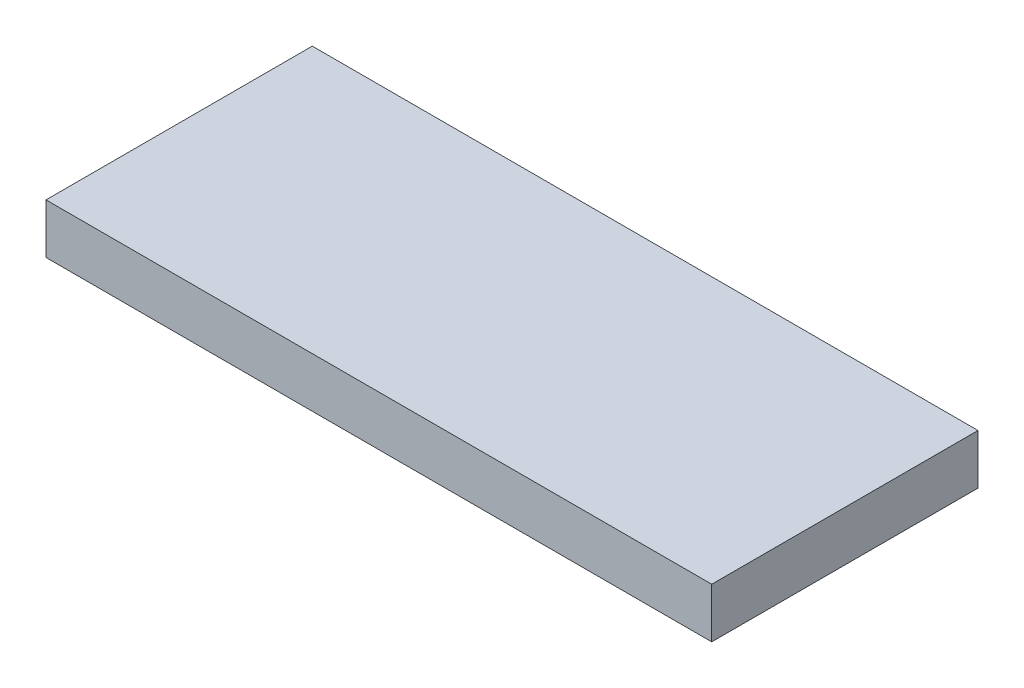
ISO-10303-21;
HEADER;
FILE_DESCRIPTION(('STEP AP214'),'2;1');
FILE_NAME('part.step','',(''),(''),'','','');
FILE_SCHEMA(('AUTOMOTIVE_DESIGN { 1 0 10303 214 1 1 1 1 }'));
ENDSEC;
DATA;
#1=APPLICATION_CONTEXT('core data for automotive mechanical design processes');
#2=APPLICATION_PROTOCOL_DEFINITION('international standard','automotive_design',2000,#1);
#3=PRODUCT_CONTEXT('',#1,'mechanical');
#4=PRODUCT('Part','Part','',(#3));
#5=PRODUCT_RELATED_PRODUCT_CATEGORY('part','',(#4));
#6=PRODUCT_DEFINITION_FORMATION('','',#4);
#7=PRODUCT_DEFINITION_CONTEXT('part definition',#1,'design');
#8=PRODUCT_DEFINITION('design','',#6,#7);
#9=PRODUCT_DEFINITION_SHAPE('','',#8);
#10=(LENGTH_UNIT() NAMED_UNIT(*) SI_UNIT(.MILLI.,.METRE.));
#11=(NAMED_UNIT(*) PLANE_ANGLE_UNIT() SI_UNIT($,.RADIAN.));
#12=(NAMED_UNIT(*) SI_UNIT($,.STERADIAN.) SOLID_ANGLE_UNIT());
#13=UNCERTAINTY_MEASURE_WITH_UNIT(LENGTH_MEASURE(1.E-05),#10,'distance_accuracy_value','');
#14=(GEOMETRIC_REPRESENTATION_CONTEXT(3) GLOBAL_UNCERTAINTY_ASSIGNED_CONTEXT((#13)) GLOBAL_UNIT_ASSIGNED_CONTEXT((#10,
#11,#12)) REPRESENTATION_CONTEXT('',''));
#15=CARTESIAN_POINT('',(0.,0.,0.));
#16=DIRECTION('',(0.,0.,1.));
#17=DIRECTION('',(1.,0.,0.));
#18=AXIS2_PLACEMENT_3D('',#15,#16,#17);
#19=CARTESIAN_POINT('',(-10.,1.5,4.));
#20=DIRECTION('',(1.,0.,0.));
#21=DIRECTION('',(0.,0.,-1.));
#22=AXIS2_PLACEMENT_3D('',#19,#20,#21);
#23=PLANE('',#22);
#24=DIRECTION('',(0.,0.,1.));
#25=VECTOR('',#24,1.);
#26=CARTESIAN_POINT('',(-10.,0.,4.));
#27=LINE('',#26,#25);
#28=CARTESIAN_POINT('',(-10.,0.,-4.));
#29=VERTEX_POINT('',#28);
#30=CARTESIAN_POINT('',(-10.,0.,4.));
#31=VERTEX_POINT('',#30);
#32=EDGE_CURVE('E102',#29,#31,#27,.T.);
#33=ORIENTED_EDGE('',*,*,#32,.T.);
#34=DIRECTION('',(0.,-1.,0.));
#35=VECTOR('',#34,1.);
#36=CARTESIAN_POINT('',(-10.,1.5,4.));
#37=LINE('',#36,#35);
#38=CARTESIAN_POINT('',(-10.,1.5,4.));
#39=VERTEX_POINT('',#38);
#40=EDGE_CURVE('E11',#39,#31,#37,.T.);
#41=ORIENTED_EDGE('',*,*,#40,.F.);
#42=DIRECTION('',(0.,0.,1.));
#43=VECTOR('',#42,1.);
#44=CARTESIAN_POINT('',(-10.,1.5,4.));
#45=LINE('',#44,#43);
#46=CARTESIAN_POINT('',(-10.,1.5,-4.));
#47=VERTEX_POINT('',#46);
#48=EDGE_CURVE('E90',#47,#39,#45,.T.);
#49=ORIENTED_EDGE('',*,*,#48,.F.);
#50=DIRECTION('',(0.,-1.,0.));
#51=VECTOR('',#50,1.);
#52=CARTESIAN_POINT('',(-10.,1.5,-4.));
#53=LINE('',#52,#51);
#54=EDGE_CURVE('E98',#47,#29,#53,.T.);
#55=ORIENTED_EDGE('',*,*,#54,.T.);
#56=EDGE_LOOP('',(#33,#41,#49,#55));
#57=FACE_BOUND('',#56,.T.);
#58=ADVANCED_FACE('F39',(#57),#23,.F.);
#59=CARTESIAN_POINT('',(9.99999999999999,1.5,4.));
#60=DIRECTION('',(0.,0.,-1.));
#61=DIRECTION('',(-1.,0.,0.));
#62=AXIS2_PLACEMENT_3D('',#59,#60,#61);
#63=PLANE('',#62);
#64=DIRECTION('',(1.,0.,0.));
#65=VECTOR('',#64,1.);
#66=CARTESIAN_POINT('',(9.99999999999999,0.,4.));
#67=LINE('',#66,#65);
#68=CARTESIAN_POINT('',(9.99999999999999,0.,4.));
#69=VERTEX_POINT('',#68);
#70=EDGE_CURVE('E94',#31,#69,#67,.T.);
#71=ORIENTED_EDGE('',*,*,#70,.T.);
#72=DIRECTION('',(0.,-1.,0.));
#73=VECTOR('',#72,1.);
#74=CARTESIAN_POINT('',(9.99999999999999,1.5,4.));
#75=LINE('',#74,#73);
#76=CARTESIAN_POINT('',(9.99999999999999,1.5,4.));
#77=VERTEX_POINT('',#76);
#78=EDGE_CURVE('E47',#77,#69,#75,.T.);
#79=ORIENTED_EDGE('',*,*,#78,.F.);
#80=DIRECTION('',(1.,0.,0.));
#81=VECTOR('',#80,1.);
#82=CARTESIAN_POINT('',(9.99999999999999,1.5,4.));
#83=LINE('',#82,#81);
#84=EDGE_CURVE('E85',#39,#77,#83,.T.);
#85=ORIENTED_EDGE('',*,*,#84,.F.);
#86=ORIENTED_EDGE('',*,*,#40,.T.);
#87=EDGE_LOOP('',(#71,#79,#85,#86));
#88=FACE_BOUND('',#87,.T.);
#89=ADVANCED_FACE('F93',(#88),#63,.F.);
#90=CARTESIAN_POINT('',(9.99999999999999,1.5,4.));
#91=DIRECTION('',(-1.,0.,0.));
#92=DIRECTION('',(0.,0.,1.));
#93=AXIS2_PLACEMENT_3D('',#90,#91,#92);
#94=PLANE('',#93);
#95=DIRECTION('',(0.,0.,-1.));
#96=VECTOR('',#95,1.);
#97=CARTESIAN_POINT('',(9.99999999999999,0.,4.));
#98=LINE('',#97,#96);
#99=CARTESIAN_POINT('',(9.99999999999999,0.,-4.));
#100=VERTEX_POINT('',#99);
#101=EDGE_CURVE('E72',#69,#100,#98,.T.);
#102=ORIENTED_EDGE('',*,*,#101,.T.);
#103=DIRECTION('',(0.,-1.,0.));
#104=VECTOR('',#103,1.);
#105=CARTESIAN_POINT('',(9.99999999999999,1.5,-4.));
#106=LINE('',#105,#104);
#107=CARTESIAN_POINT('',(9.99999999999999,1.5,-4.));
#108=VERTEX_POINT('',#107);
#109=EDGE_CURVE('E95',#108,#100,#106,.T.);
#110=ORIENTED_EDGE('',*,*,#109,.F.);
#111=DIRECTION('',(0.,0.,-1.));
#112=VECTOR('',#111,1.);
#113=CARTESIAN_POINT('',(9.99999999999999,1.5,4.));
#114=LINE('',#113,#112);
#115=EDGE_CURVE('E88',#77,#108,#114,.T.);
#116=ORIENTED_EDGE('',*,*,#115,.F.);
#117=ORIENTED_EDGE('',*,*,#78,.T.);
#118=EDGE_LOOP('',(#102,#110,#116,#117));
#119=FACE_BOUND('',#118,.T.);
#120=ADVANCED_FACE('F96',(#119),#94,.F.);
#121=CARTESIAN_POINT('',(9.99999999999999,1.5,-4.));
#122=DIRECTION('',(0.,0.,1.));
#123=DIRECTION('',(1.,0.,0.));
#124=AXIS2_PLACEMENT_3D('',#121,#122,#123);
#125=PLANE('',#124);
#126=DIRECTION('',(-1.,0.,0.));
#127=VECTOR('',#126,1.);
#128=CARTESIAN_POINT('',(9.99999999999999,0.,-4.));
#129=LINE('',#128,#127);
#130=EDGE_CURVE('E78',#100,#29,#129,.T.);
#131=ORIENTED_EDGE('',*,*,#130,.T.);
#132=ORIENTED_EDGE('',*,*,#54,.F.);
#133=DIRECTION('',(-1.,0.,0.));
#134=VECTOR('',#133,1.);
#135=CARTESIAN_POINT('',(9.99999999999999,1.5,-4.));
#136=LINE('',#135,#134);
#137=EDGE_CURVE('E55',#108,#47,#136,.T.);
#138=ORIENTED_EDGE('',*,*,#137,.F.);
#139=ORIENTED_EDGE('',*,*,#109,.T.);
#140=EDGE_LOOP('',(#131,#132,#138,#139));
#141=FACE_BOUND('',#140,.T.);
#142=ADVANCED_FACE('F109',(#141),#125,.F.);
#143=CARTESIAN_POINT('',(0.,1.5,0.));
#144=DIRECTION('',(0.,1.,0.));
#145=DIRECTION('',(0.,0.,1.));
#146=AXIS2_PLACEMENT_3D('',#143,#144,#145);
#147=PLANE('',#146);
#148=ORIENTED_EDGE('',*,*,#48,.T.);
#149=ORIENTED_EDGE('',*,*,#84,.T.);
#150=ORIENTED_EDGE('',*,*,#115,.T.);
#151=ORIENTED_EDGE('',*,*,#137,.T.);
#152=EDGE_LOOP('',(#148,#149,#150,#151));
#153=FACE_BOUND('',#152,.T.);
#154=ADVANCED_FACE('F86',(#153),#147,.T.);
#155=CARTESIAN_POINT('',(0.,0.,0.));
#156=DIRECTION('',(0.,1.,0.));
#157=DIRECTION('',(0.,0.,1.));
#158=AXIS2_PLACEMENT_3D('',#155,#156,#157);
#159=PLANE('',#158);
#160=ORIENTED_EDGE('',*,*,#32,.F.);
#161=ORIENTED_EDGE('',*,*,#130,.F.);
#162=ORIENTED_EDGE('',*,*,#101,.F.);
#163=ORIENTED_EDGE('',*,*,#70,.F.);
#164=EDGE_LOOP('',(#160,#161,#162,#163));
#165=FACE_BOUND('',#164,.T.);
#166=ADVANCED_FACE('F112',(#165),#159,.F.);
#167=CLOSED_SHELL('',(#58,#89,#120,#142,#154,#166));
#168=MANIFOLD_SOLID_BREP('B2',#167);
#169=ADVANCED_BREP_SHAPE_REPRESENTATION('',(#18,#168),#14);
#170=SHAPE_DEFINITION_REPRESENTATION(#9,#169);
ENDSEC;
END-ISO-10303-21;
